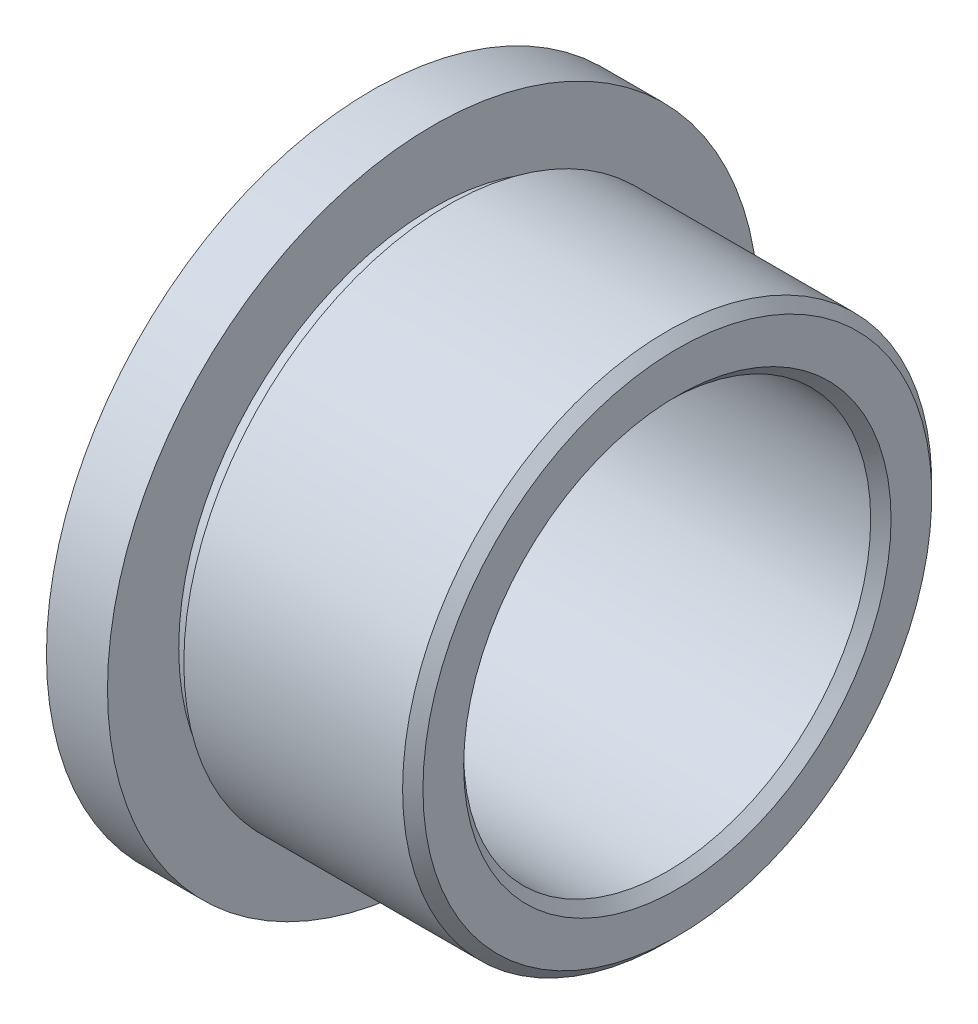
ISO-10303-21;
HEADER;
FILE_DESCRIPTION(('STEP AP214'),'2;1');
FILE_NAME('part.step','',(''),(''),'','','');
FILE_SCHEMA(('AUTOMOTIVE_DESIGN { 1 0 10303 214 1 1 1 1 }'));
ENDSEC;
DATA;
#1=APPLICATION_CONTEXT('core data for automotive mechanical design processes');
#2=APPLICATION_PROTOCOL_DEFINITION('international standard','automotive_design',2000,#1);
#3=PRODUCT_CONTEXT('',#1,'mechanical');
#4=PRODUCT('Part','Part','',(#3));
#5=PRODUCT_RELATED_PRODUCT_CATEGORY('part','',(#4));
#6=PRODUCT_DEFINITION_FORMATION('','',#4);
#7=PRODUCT_DEFINITION_CONTEXT('part definition',#1,'design');
#8=PRODUCT_DEFINITION('design','',#6,#7);
#9=PRODUCT_DEFINITION_SHAPE('','',#8);
#10=(LENGTH_UNIT() NAMED_UNIT(*) SI_UNIT(.MILLI.,.METRE.));
#11=(NAMED_UNIT(*) PLANE_ANGLE_UNIT() SI_UNIT($,.RADIAN.));
#12=(NAMED_UNIT(*) SI_UNIT($,.STERADIAN.) SOLID_ANGLE_UNIT());
#13=UNCERTAINTY_MEASURE_WITH_UNIT(LENGTH_MEASURE(1.E-05),#10,'distance_accuracy_value','');
#14=(GEOMETRIC_REPRESENTATION_CONTEXT(3) GLOBAL_UNCERTAINTY_ASSIGNED_CONTEXT((#13)) GLOBAL_UNIT_ASSIGNED_CONTEXT((#10,
#11,#12)) REPRESENTATION_CONTEXT('',''));
#15=CARTESIAN_POINT('',(0.,0.,0.));
#16=DIRECTION('',(0.,0.,1.));
#17=DIRECTION('',(1.,0.,0.));
#18=AXIS2_PLACEMENT_3D('',#15,#16,#17);
#19=CARTESIAN_POINT('',(0.,0.,0.));
#20=DIRECTION('',(-1.,0.,0.));
#21=DIRECTION('',(0.,0.,1.));
#22=AXIS2_PLACEMENT_3D('',#19,#20,#21);
#23=CYLINDRICAL_SURFACE('',#22,16.);
#24=CARTESIAN_POINT('',(0.,0.,0.));
#25=DIRECTION('',(-1.,0.,0.));
#26=DIRECTION('',(0.,0.,1.));
#27=AXIS2_PLACEMENT_3D('',#24,#25,#26);
#28=CIRCLE('',#27,16.);
#29=CARTESIAN_POINT('',(0.,0.,16.));
#30=VERTEX_POINT('',#29);
#31=EDGE_CURVE('E64',#30,#30,#28,.T.);
#32=ORIENTED_EDGE('',*,*,#31,.F.);
#33=EDGE_LOOP('',(#32));
#34=FACE_BOUND('',#33,.T.);
#35=CARTESIAN_POINT('',(3.,0.,0.));
#36=DIRECTION('',(-1.,0.,0.));
#37=DIRECTION('',(0.,0.,1.));
#38=AXIS2_PLACEMENT_3D('',#35,#36,#37);
#39=CIRCLE('',#38,16.);
#40=CARTESIAN_POINT('',(3.,0.,16.));
#41=VERTEX_POINT('',#40);
#42=EDGE_CURVE('E52',#41,#41,#39,.T.);
#43=ORIENTED_EDGE('',*,*,#42,.T.);
#44=EDGE_LOOP('',(#43));
#45=FACE_BOUND('',#44,.T.);
#46=ADVANCED_FACE('F27',(#34,#45),#23,.T.);
#47=CARTESIAN_POINT('',(3.,12.5,0.));
#48=DIRECTION('',(-1.,0.,0.));
#49=DIRECTION('',(0.,0.,1.));
#50=AXIS2_PLACEMENT_3D('',#47,#48,#49);
#51=PLANE('',#50);
#52=ORIENTED_EDGE('',*,*,#42,.F.);
#53=EDGE_LOOP('',(#52));
#54=FACE_BOUND('',#53,.T.);
#55=CARTESIAN_POINT('',(3.,0.,0.));
#56=DIRECTION('',(-1.,0.,0.));
#57=DIRECTION('',(0.,0.,1.));
#58=AXIS2_PLACEMENT_3D('',#55,#56,#57);
#59=CIRCLE('',#58,12.5);
#60=CARTESIAN_POINT('',(3.,0.,12.5));
#61=VERTEX_POINT('',#60);
#62=EDGE_CURVE('E55',#61,#61,#59,.T.);
#63=ORIENTED_EDGE('',*,*,#62,.T.);
#64=EDGE_LOOP('',(#63));
#65=FACE_BOUND('',#64,.T.);
#66=ADVANCED_FACE('F72',(#54,#65),#51,.F.);
#67=CARTESIAN_POINT('',(0.,0.,0.));
#68=DIRECTION('',(-1.,0.,0.));
#69=DIRECTION('',(0.,0.,1.));
#70=AXIS2_PLACEMENT_3D('',#67,#68,#69);
#71=CYLINDRICAL_SURFACE('',#70,12.5);
#72=ORIENTED_EDGE('',*,*,#62,.F.);
#73=EDGE_LOOP('',(#72));
#74=FACE_BOUND('',#73,.T.);
#75=CARTESIAN_POINT('',(3.75,0.,0.));
#76=DIRECTION('',(-1.,0.,0.));
#77=DIRECTION('',(0.,0.,1.));
#78=AXIS2_PLACEMENT_3D('',#75,#76,#77);
#79=CIRCLE('',#78,12.5);
#80=CARTESIAN_POINT('',(3.75,0.,12.5));
#81=VERTEX_POINT('',#80);
#82=EDGE_CURVE('E58',#81,#81,#79,.T.);
#83=ORIENTED_EDGE('',*,*,#82,.T.);
#84=EDGE_LOOP('',(#83));
#85=FACE_BOUND('',#84,.T.);
#86=ADVANCED_FACE('F77',(#74,#85),#71,.T.);
#87=CARTESIAN_POINT('',(3.75,13.,0.));
#88=DIRECTION('',(1.,0.,0.));
#89=DIRECTION('',(0.,0.,-1.));
#90=AXIS2_PLACEMENT_3D('',#87,#88,#89);
#91=PLANE('',#90);
#92=ORIENTED_EDGE('',*,*,#82,.F.);
#93=EDGE_LOOP('',(#92));
#94=FACE_BOUND('',#93,.T.);
#95=CARTESIAN_POINT('',(3.75,0.,0.));
#96=DIRECTION('',(-1.,0.,0.));
#97=DIRECTION('',(0.,0.,1.));
#98=AXIS2_PLACEMENT_3D('',#95,#96,#97);
#99=CIRCLE('',#98,13.);
#100=CARTESIAN_POINT('',(3.75,0.,13.));
#101=VERTEX_POINT('',#100);
#102=EDGE_CURVE('E61',#101,#101,#99,.T.);
#103=ORIENTED_EDGE('',*,*,#102,.T.);
#104=EDGE_LOOP('',(#103));
#105=FACE_BOUND('',#104,.T.);
#106=ADVANCED_FACE('F82',(#94,#105),#91,.F.);
#107=CARTESIAN_POINT('',(0.,0.,0.));
#108=DIRECTION('',(-1.,0.,0.));
#109=DIRECTION('',(0.,0.,1.));
#110=AXIS2_PLACEMENT_3D('',#107,#108,#109);
#111=CYLINDRICAL_SURFACE('',#110,13.);
#112=CARTESIAN_POINT('',(14.5,0.,0.));
#113=DIRECTION('',(-1.,0.,0.));
#114=DIRECTION('',(0.,0.,1.));
#115=AXIS2_PLACEMENT_3D('',#112,#113,#114);
#116=CIRCLE('',#115,13.);
#117=CARTESIAN_POINT('',(14.5,0.,13.));
#118=VERTEX_POINT('',#117);
#119=EDGE_CURVE('E49',#118,#118,#116,.T.);
#120=ORIENTED_EDGE('',*,*,#119,.T.);
#121=EDGE_LOOP('',(#120));
#122=FACE_BOUND('',#121,.T.);
#123=ORIENTED_EDGE('',*,*,#102,.F.);
#124=EDGE_LOOP('',(#123));
#125=FACE_BOUND('',#124,.T.);
#126=ADVANCED_FACE('F88',(#122,#125),#111,.T.);
#127=CARTESIAN_POINT('',(15.,10.,0.));
#128=DIRECTION('',(-1.,0.,0.));
#129=DIRECTION('',(0.,0.,1.));
#130=AXIS2_PLACEMENT_3D('',#127,#128,#129);
#131=PLANE('',#130);
#132=CARTESIAN_POINT('',(15.,0.,0.));
#133=DIRECTION('',(-1.,0.,0.));
#134=DIRECTION('',(0.,0.,1.));
#135=AXIS2_PLACEMENT_3D('',#132,#133,#134);
#136=CIRCLE('',#135,12.5);
#137=CARTESIAN_POINT('',(15.,0.,12.5));
#138=VERTEX_POINT('',#137);
#139=EDGE_CURVE('E41',#138,#138,#136,.F.);
#140=ORIENTED_EDGE('',*,*,#139,.T.);
#141=EDGE_LOOP('',(#140));
#142=FACE_BOUND('',#141,.T.);
#143=CARTESIAN_POINT('',(15.,0.,0.));
#144=DIRECTION('',(-1.,0.,0.));
#145=DIRECTION('',(0.,0.,1.));
#146=AXIS2_PLACEMENT_3D('',#143,#144,#145);
#147=CIRCLE('',#146,10.5);
#148=CARTESIAN_POINT('',(15.,0.,10.5));
#149=VERTEX_POINT('',#148);
#150=EDGE_CURVE('E46',#149,#149,#147,.T.);
#151=ORIENTED_EDGE('',*,*,#150,.T.);
#152=EDGE_LOOP('',(#151));
#153=FACE_BOUND('',#152,.T.);
#154=ADVANCED_FACE('F93',(#142,#153),#131,.F.);
#155=CARTESIAN_POINT('',(0.,0.,0.));
#156=DIRECTION('',(-1.,0.,0.));
#157=DIRECTION('',(0.,0.,1.));
#158=AXIS2_PLACEMENT_3D('',#155,#156,#157);
#159=CYLINDRICAL_SURFACE('',#158,10.);
#160=CARTESIAN_POINT('',(14.5,0.,0.));
#161=DIRECTION('',(-1.,0.,0.));
#162=DIRECTION('',(0.,0.,1.));
#163=AXIS2_PLACEMENT_3D('',#160,#161,#162);
#164=CIRCLE('',#163,10.);
#165=CARTESIAN_POINT('',(14.5,0.,10.));
#166=VERTEX_POINT('',#165);
#167=EDGE_CURVE('E33',#166,#166,#164,.F.);
#168=ORIENTED_EDGE('',*,*,#167,.T.);
#169=EDGE_LOOP('',(#168));
#170=FACE_BOUND('',#169,.T.);
#171=CARTESIAN_POINT('',(0.500000000000002,0.,0.));
#172=DIRECTION('',(1.,0.,0.));
#173=DIRECTION('',(0.,0.,-1.));
#174=AXIS2_PLACEMENT_3D('',#171,#172,#173);
#175=CIRCLE('',#174,10.);
#176=CARTESIAN_POINT('',(0.500000000000002,0.,-10.));
#177=VERTEX_POINT('',#176);
#178=EDGE_CURVE('E37',#177,#177,#175,.F.);
#179=ORIENTED_EDGE('',*,*,#178,.T.);
#180=EDGE_LOOP('',(#179));
#181=FACE_BOUND('',#180,.T.);
#182=ADVANCED_FACE('F99',(#170,#181),#159,.F.);
#183=CARTESIAN_POINT('',(0.,16.,0.));
#184=DIRECTION('',(1.,0.,0.));
#185=DIRECTION('',(0.,0.,-1.));
#186=AXIS2_PLACEMENT_3D('',#183,#184,#185);
#187=PLANE('',#186);
#188=CARTESIAN_POINT('',(0.,0.,0.));
#189=DIRECTION('',(1.,0.,0.));
#190=DIRECTION('',(0.,0.,-1.));
#191=AXIS2_PLACEMENT_3D('',#188,#189,#190);
#192=CIRCLE('',#191,10.5);
#193=CARTESIAN_POINT('',(0.,0.,-10.5));
#194=VERTEX_POINT('',#193);
#195=EDGE_CURVE('E10',#194,#194,#192,.T.);
#196=ORIENTED_EDGE('',*,*,#195,.T.);
#197=EDGE_LOOP('',(#196));
#198=FACE_BOUND('',#197,.T.);
#199=ORIENTED_EDGE('',*,*,#31,.T.);
#200=EDGE_LOOP('',(#199));
#201=FACE_BOUND('',#200,.T.);
#202=ADVANCED_FACE('F68',(#198,#201),#187,.F.);
#203=CARTESIAN_POINT('',(14.5,0.,0.));
#204=DIRECTION('',(-1.,0.,0.));
#205=DIRECTION('',(0.,0.,1.));
#206=AXIS2_PLACEMENT_3D('',#203,#204,#205);
#207=CONICAL_SURFACE('',#206,13.,0.785398163397453);
#208=ORIENTED_EDGE('',*,*,#139,.F.);
#209=EDGE_LOOP('',(#208));
#210=FACE_BOUND('',#209,.T.);
#211=ORIENTED_EDGE('',*,*,#119,.F.);
#212=EDGE_LOOP('',(#211));
#213=FACE_BOUND('',#212,.T.);
#214=ADVANCED_FACE('F107',(#210,#213),#207,.T.);
#215=CARTESIAN_POINT('',(15.,0.,0.));
#216=DIRECTION('',(1.,0.,0.));
#217=DIRECTION('',(0.,0.,-1.));
#218=AXIS2_PLACEMENT_3D('',#215,#216,#217);
#219=CONICAL_SURFACE('',#218,10.5,0.78539816339745);
#220=ORIENTED_EDGE('',*,*,#167,.F.);
#221=EDGE_LOOP('',(#220));
#222=FACE_BOUND('',#221,.T.);
#223=ORIENTED_EDGE('',*,*,#150,.F.);
#224=EDGE_LOOP('',(#223));
#225=FACE_BOUND('',#224,.T.);
#226=ADVANCED_FACE('F110',(#222,#225),#219,.F.);
#227=CARTESIAN_POINT('',(0.500000000000002,0.,0.));
#228=DIRECTION('',(-1.,0.,0.));
#229=DIRECTION('',(0.,0.,1.));
#230=AXIS2_PLACEMENT_3D('',#227,#228,#229);
#231=CONICAL_SURFACE('',#230,10.,0.78539816339745);
#232=ORIENTED_EDGE('',*,*,#195,.F.);
#233=EDGE_LOOP('',(#232));
#234=FACE_BOUND('',#233,.T.);
#235=ORIENTED_EDGE('',*,*,#178,.F.);
#236=EDGE_LOOP('',(#235));
#237=FACE_BOUND('',#236,.T.);
#238=ADVANCED_FACE('F114',(#234,#237),#231,.F.);
#239=CLOSED_SHELL('',(#46,#66,#86,#106,#126,#154,#182,#202,#214,#226,#238));
#240=MANIFOLD_SOLID_BREP('B2',#239);
#241=ADVANCED_BREP_SHAPE_REPRESENTATION('',(#18,#240),#14);
#242=SHAPE_DEFINITION_REPRESENTATION(#9,#241);
ENDSEC;
END-ISO-10303-21;
